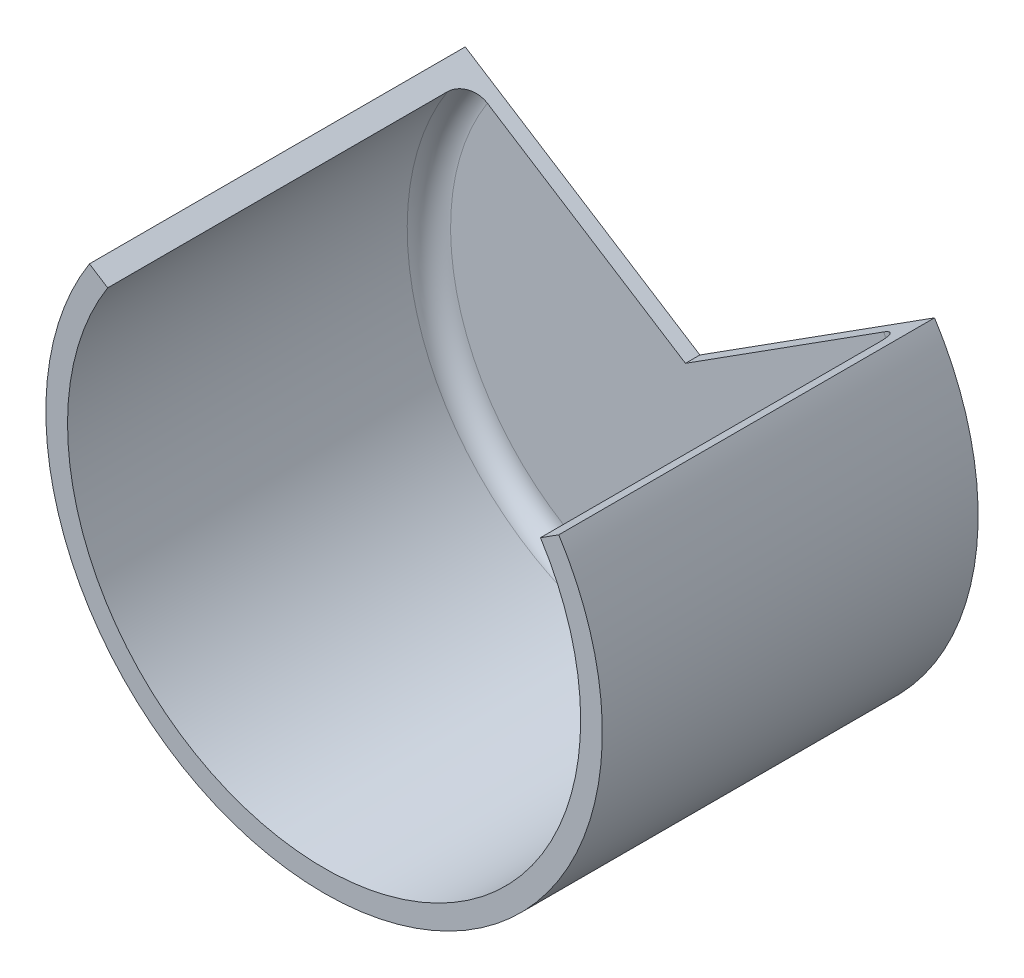
ISO-10303-21;
HEADER;
FILE_DESCRIPTION(('STEP AP214'),'2;1');
FILE_NAME('part.step','',(''),(''),'','','');
FILE_SCHEMA(('AUTOMOTIVE_DESIGN { 1 0 10303 214 1 1 1 1 }'));
ENDSEC;
DATA;
#1=APPLICATION_CONTEXT('core data for automotive mechanical design processes');
#2=APPLICATION_PROTOCOL_DEFINITION('international standard','automotive_design',2000,#1);
#3=PRODUCT_CONTEXT('',#1,'mechanical');
#4=PRODUCT('Part','Part','',(#3));
#5=PRODUCT_RELATED_PRODUCT_CATEGORY('part','',(#4));
#6=PRODUCT_DEFINITION_FORMATION('','',#4);
#7=PRODUCT_DEFINITION_CONTEXT('part definition',#1,'design');
#8=PRODUCT_DEFINITION('design','',#6,#7);
#9=PRODUCT_DEFINITION_SHAPE('','',#8);
#10=(LENGTH_UNIT() NAMED_UNIT(*) SI_UNIT(.MILLI.,.METRE.));
#11=(NAMED_UNIT(*) PLANE_ANGLE_UNIT() SI_UNIT($,.RADIAN.));
#12=(NAMED_UNIT(*) SI_UNIT($,.STERADIAN.) SOLID_ANGLE_UNIT());
#13=UNCERTAINTY_MEASURE_WITH_UNIT(LENGTH_MEASURE(1.E-05),#10,'distance_accuracy_value','');
#14=(GEOMETRIC_REPRESENTATION_CONTEXT(3) GLOBAL_UNCERTAINTY_ASSIGNED_CONTEXT((#13)) GLOBAL_UNIT_ASSIGNED_CONTEXT((#10,
#11,#12)) REPRESENTATION_CONTEXT('',''));
#15=CARTESIAN_POINT('',(0.,0.,0.));
#16=DIRECTION('',(0.,0.,1.));
#17=DIRECTION('',(1.,0.,0.));
#18=AXIS2_PLACEMENT_3D('',#15,#16,#17);
#19=CARTESIAN_POINT('',(0.,0.,25.));
#20=DIRECTION('',(0.,0.,1.));
#21=DIRECTION('',(1.,0.,0.));
#22=AXIS2_PLACEMENT_3D('',#19,#20,#21);
#23=PLANE('',#22);
#24=DIRECTION('',(-0.843391445812885,0.537299608346825,0.));
#25=VECTOR('',#24,1.);
#26=CARTESIAN_POINT('',(0.,0.,25.));
#27=LINE('',#26,#25);
#28=CARTESIAN_POINT('',(-14.9701981631787,9.53706804815614,25.));
#29=VERTEX_POINT('',#28);
#30=CARTESIAN_POINT('',(-16.235285331898,10.3430174606764,25.));
#31=VERTEX_POINT('',#30);
#32=EDGE_CURVE('E94',#29,#31,#27,.T.);
#33=ORIENTED_EDGE('',*,*,#32,.T.);
#34=CARTESIAN_POINT('',(0.,0.,25.));
#35=DIRECTION('',(0.,0.,1.));
#36=DIRECTION('',(1.,0.,0.));
#37=AXIS2_PLACEMENT_3D('',#34,#35,#36);
#38=CIRCLE('',#37,19.25);
#39=CARTESIAN_POINT('',(16.235285331898,10.3430174606764,25.));
#40=VERTEX_POINT('',#39);
#41=EDGE_CURVE('E102',#31,#40,#38,.T.);
#42=ORIENTED_EDGE('',*,*,#41,.T.);
#43=DIRECTION('',(-0.843391445812885,-0.537299608346825,0.));
#44=VECTOR('',#43,1.);
#45=CARTESIAN_POINT('',(16.235285331898,10.3430174606764,25.));
#46=LINE('',#45,#44);
#47=CARTESIAN_POINT('',(14.9701981631787,9.53706804815614,25.));
#48=VERTEX_POINT('',#47);
#49=EDGE_CURVE('E83',#40,#48,#46,.T.);
#50=ORIENTED_EDGE('',*,*,#49,.T.);
#51=CARTESIAN_POINT('',(0.,0.,25.));
#52=DIRECTION('',(0.,0.,1.));
#53=DIRECTION('',(1.,0.,0.));
#54=AXIS2_PLACEMENT_3D('',#51,#52,#53);
#55=CIRCLE('',#54,17.75);
#56=EDGE_CURVE('E109',#29,#48,#55,.T.);
#57=ORIENTED_EDGE('',*,*,#56,.F.);
#58=EDGE_LOOP('',(#33,#42,#50,#57));
#59=FACE_BOUND('',#58,.T.);
#60=ADVANCED_FACE('F33',(#59),#23,.T.);
#61=CARTESIAN_POINT('',(0.,0.,25.));
#62=DIRECTION('',(0.,0.,-1.));
#63=DIRECTION('',(-1.,0.,0.));
#64=AXIS2_PLACEMENT_3D('',#61,#62,#63);
#65=CYLINDRICAL_SURFACE('',#64,19.25);
#66=ORIENTED_EDGE('',*,*,#41,.F.);
#67=DIRECTION('',(0.,0.,-1.));
#68=VECTOR('',#67,1.);
#69=CARTESIAN_POINT('',(-16.235285331898,10.3430174606764,25.));
#70=LINE('',#69,#68);
#71=CARTESIAN_POINT('',(-16.235285331898,10.3430174606764,-1.));
#72=VERTEX_POINT('',#71);
#73=EDGE_CURVE('E124',#31,#72,#70,.T.);
#74=ORIENTED_EDGE('',*,*,#73,.T.);
#75=CARTESIAN_POINT('',(0.,0.,-1.));
#76=DIRECTION('',(0.,0.,-1.));
#77=DIRECTION('',(-1.,0.,0.));
#78=AXIS2_PLACEMENT_3D('',#75,#76,#77);
#79=CIRCLE('',#78,19.25);
#80=CARTESIAN_POINT('',(16.235285331898,10.3430174606764,-1.));
#81=VERTEX_POINT('',#80);
#82=EDGE_CURVE('E104',#81,#72,#79,.T.);
#83=ORIENTED_EDGE('',*,*,#82,.F.);
#84=DIRECTION('',(0.,0.,-1.));
#85=VECTOR('',#84,1.);
#86=CARTESIAN_POINT('',(16.235285331898,10.3430174606764,25.));
#87=LINE('',#86,#85);
#88=EDGE_CURVE('E87',#40,#81,#87,.T.);
#89=ORIENTED_EDGE('',*,*,#88,.F.);
#90=EDGE_LOOP('',(#66,#74,#83,#89));
#91=FACE_BOUND('',#90,.T.);
#92=ADVANCED_FACE('F100',(#91),#65,.T.);
#93=CARTESIAN_POINT('',(0.,0.,25.));
#94=DIRECTION('',(0.,0.,-1.));
#95=DIRECTION('',(-1.,0.,0.));
#96=AXIS2_PLACEMENT_3D('',#93,#94,#95);
#97=CYLINDRICAL_SURFACE('',#96,17.75);
#98=DIRECTION('',(0.,0.,-1.));
#99=VECTOR('',#98,1.);
#100=CARTESIAN_POINT('',(14.9701981631787,9.53706804815614,25.));
#101=LINE('',#100,#99);
#102=CARTESIAN_POINT('',(14.9701981631787,9.53706804815614,1.5));
#103=VERTEX_POINT('',#102);
#104=EDGE_CURVE('E89',#103,#48,#101,.F.);
#105=ORIENTED_EDGE('',*,*,#104,.F.);
#106=CARTESIAN_POINT('',(0.,0.,1.5));
#107=DIRECTION('',(0.,0.,-1.));
#108=DIRECTION('',(-1.,0.,0.));
#109=AXIS2_PLACEMENT_3D('',#106,#107,#108);
#110=CIRCLE('',#109,17.75);
#111=CARTESIAN_POINT('',(-14.9701981631787,9.53706804815614,1.5));
#112=VERTEX_POINT('',#111);
#113=EDGE_CURVE('E54',#103,#112,#110,.T.);
#114=ORIENTED_EDGE('',*,*,#113,.T.);
#115=DIRECTION('',(0.,0.,-1.));
#116=VECTOR('',#115,1.);
#117=CARTESIAN_POINT('',(-14.9701981631787,9.53706804815614,25.));
#118=LINE('',#117,#116);
#119=EDGE_CURVE('E117',#29,#112,#118,.T.);
#120=ORIENTED_EDGE('',*,*,#119,.F.);
#121=ORIENTED_EDGE('',*,*,#56,.T.);
#122=EDGE_LOOP('',(#105,#114,#120,#121));
#123=FACE_BOUND('',#122,.T.);
#124=ADVANCED_FACE('F153',(#123),#97,.F.);
#125=CARTESIAN_POINT('',(0.,0.,0.));
#126=DIRECTION('',(0.,0.,-1.));
#127=DIRECTION('',(-1.,0.,0.));
#128=AXIS2_PLACEMENT_3D('',#125,#126,#127);
#129=PLANE('',#128);
#130=DIRECTION('',(-0.843391445812885,0.537299608346825,0.));
#131=VECTOR('',#130,1.);
#132=CARTESIAN_POINT('',(0.,0.,0.));
#133=LINE('',#132,#131);
#134=CARTESIAN_POINT('',(0.,0.,0.));
#135=VERTEX_POINT('',#134);
#136=CARTESIAN_POINT('',(-13.7051109944594,8.7311186356359,0.));
#137=VERTEX_POINT('',#136);
#138=EDGE_CURVE('E119',#135,#137,#133,.T.);
#139=ORIENTED_EDGE('',*,*,#138,.T.);
#140=CARTESIAN_POINT('',(0.,0.,0.));
#141=DIRECTION('',(0.,0.,-1.));
#142=DIRECTION('',(-1.,0.,0.));
#143=AXIS2_PLACEMENT_3D('',#140,#141,#142);
#144=CIRCLE('',#143,16.25);
#145=CARTESIAN_POINT('',(13.7051109944594,8.7311186356359,0.));
#146=VERTEX_POINT('',#145);
#147=EDGE_CURVE('E108',#137,#146,#144,.F.);
#148=ORIENTED_EDGE('',*,*,#147,.T.);
#149=DIRECTION('',(-0.843391445812885,-0.537299608346825,0.));
#150=VECTOR('',#149,1.);
#151=CARTESIAN_POINT('',(0.,0.,0.));
#152=LINE('',#151,#150);
#153=EDGE_CURVE('E123',#146,#135,#152,.T.);
#154=ORIENTED_EDGE('',*,*,#153,.T.);
#155=EDGE_LOOP('',(#139,#148,#154));
#156=FACE_BOUND('',#155,.T.);
#157=ADVANCED_FACE('F141',(#156),#129,.F.);
#158=CARTESIAN_POINT('',(0.,0.,-1.));
#159=DIRECTION('',(0.,0.,-1.));
#160=DIRECTION('',(-1.,0.,0.));
#161=AXIS2_PLACEMENT_3D('',#158,#159,#160);
#162=PLANE('',#161);
#163=DIRECTION('',(-0.843391445812885,0.537299608346825,0.));
#164=VECTOR('',#163,1.);
#165=CARTESIAN_POINT('',(0.,0.,-1.));
#166=LINE('',#165,#164);
#167=CARTESIAN_POINT('',(0.,0.,-1.));
#168=VERTEX_POINT('',#167);
#169=EDGE_CURVE('E95',#168,#72,#166,.T.);
#170=ORIENTED_EDGE('',*,*,#169,.F.);
#171=DIRECTION('',(-0.843391445812885,-0.537299608346825,0.));
#172=VECTOR('',#171,1.);
#173=CARTESIAN_POINT('',(16.235285331898,10.3430174606764,-1.));
#174=LINE('',#173,#172);
#175=EDGE_CURVE('E129',#81,#168,#174,.T.);
#176=ORIENTED_EDGE('',*,*,#175,.F.);
#177=ORIENTED_EDGE('',*,*,#82,.T.);
#178=EDGE_LOOP('',(#170,#176,#177));
#179=FACE_BOUND('',#178,.T.);
#180=ADVANCED_FACE('F134',(#179),#162,.T.);
#181=CARTESIAN_POINT('',(0.,0.,25.));
#182=DIRECTION('',(-0.537299608346825,-0.843391445812885,0.));
#183=DIRECTION('',(0.843391445812885,-0.537299608346825,0.));
#184=AXIS2_PLACEMENT_3D('',#181,#182,#183);
#185=PLANE('',#184);
#186=ORIENTED_EDGE('',*,*,#119,.T.);
#187=CARTESIAN_POINT('',(-13.7051109944594,8.7311186356359,1.5));
#188=DIRECTION('',(-0.537299608346825,-0.843391445812885,0.));
#189=DIRECTION('',(0.843391445812885,-0.537299608346825,0.));
#190=AXIS2_PLACEMENT_3D('',#187,#188,#189);
#191=CIRCLE('',#190,1.5);
#192=EDGE_CURVE('E11',#112,#137,#191,.T.);
#193=ORIENTED_EDGE('',*,*,#192,.T.);
#194=ORIENTED_EDGE('',*,*,#138,.F.);
#195=DIRECTION('',(0.,0.,-1.));
#196=VECTOR('',#195,1.);
#197=CARTESIAN_POINT('',(0.,0.,25.));
#198=LINE('',#197,#196);
#199=EDGE_CURVE('E105',#135,#168,#198,.T.);
#200=ORIENTED_EDGE('',*,*,#199,.T.);
#201=ORIENTED_EDGE('',*,*,#169,.T.);
#202=ORIENTED_EDGE('',*,*,#73,.F.);
#203=ORIENTED_EDGE('',*,*,#32,.F.);
#204=EDGE_LOOP('',(#186,#193,#194,#200,#201,#202,#203));
#205=FACE_BOUND('',#204,.T.);
#206=ADVANCED_FACE('F136',(#205),#185,.F.);
#207=CARTESIAN_POINT('',(16.235285331898,10.3430174606764,25.));
#208=DIRECTION('',(0.537299608346825,-0.843391445812885,0.));
#209=DIRECTION('',(0.843391445812885,0.537299608346825,0.));
#210=AXIS2_PLACEMENT_3D('',#207,#208,#209);
#211=PLANE('',#210);
#212=ORIENTED_EDGE('',*,*,#153,.F.);
#213=CARTESIAN_POINT('',(13.7051109944594,8.7311186356359,1.5));
#214=DIRECTION('',(0.537299608346825,-0.843391445812885,0.));
#215=DIRECTION('',(0.843391445812885,0.537299608346825,0.));
#216=AXIS2_PLACEMENT_3D('',#213,#214,#215);
#217=CIRCLE('',#216,1.5);
#218=EDGE_CURVE('E41',#146,#103,#217,.T.);
#219=ORIENTED_EDGE('',*,*,#218,.T.);
#220=ORIENTED_EDGE('',*,*,#104,.T.);
#221=ORIENTED_EDGE('',*,*,#49,.F.);
#222=ORIENTED_EDGE('',*,*,#88,.T.);
#223=ORIENTED_EDGE('',*,*,#175,.T.);
#224=ORIENTED_EDGE('',*,*,#199,.F.);
#225=EDGE_LOOP('',(#212,#219,#220,#221,#222,#223,#224));
#226=FACE_BOUND('',#225,.T.);
#227=ADVANCED_FACE('F85',(#226),#211,.F.);
#228=CARTESIAN_POINT('',(0.,0.,1.5));
#229=DIRECTION('',(0.,0.,-1.));
#230=DIRECTION('',(-1.,0.,0.));
#231=AXIS2_PLACEMENT_3D('',#228,#229,#230);
#232=TOROIDAL_SURFACE('',#231,16.25,1.5);
#233=ORIENTED_EDGE('',*,*,#192,.F.);
#234=ORIENTED_EDGE('',*,*,#113,.F.);
#235=ORIENTED_EDGE('',*,*,#218,.F.);
#236=ORIENTED_EDGE('',*,*,#147,.F.);
#237=EDGE_LOOP('',(#233,#234,#235,#236));
#238=FACE_BOUND('',#237,.T.);
#239=ADVANCED_FACE('F35',(#238),#232,.F.);
#240=CLOSED_SHELL('',(#60,#92,#124,#157,#180,#206,#227,#239));
#241=MANIFOLD_SOLID_BREP('B2',#240);
#242=ADVANCED_BREP_SHAPE_REPRESENTATION('',(#18,#241),#14);
#243=SHAPE_DEFINITION_REPRESENTATION(#9,#242);
ENDSEC;
END-ISO-10303-21;
